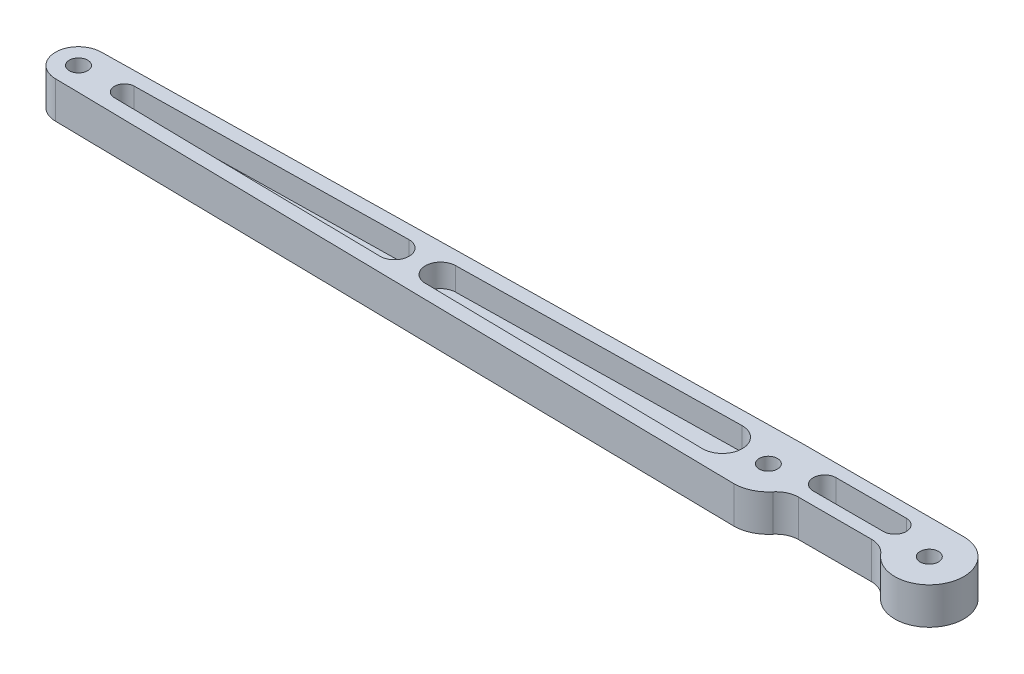
ISO-10303-21;
HEADER;
FILE_DESCRIPTION(('STEP AP214'),'2;1');
FILE_NAME('part.step','',(''),(''),'','','');
FILE_SCHEMA(('AUTOMOTIVE_DESIGN { 1 0 10303 214 1 1 1 1 }'));
ENDSEC;
DATA;
#1=APPLICATION_CONTEXT('core data for automotive mechanical design processes');
#2=APPLICATION_PROTOCOL_DEFINITION('international standard','automotive_design',2000,#1);
#3=PRODUCT_CONTEXT('',#1,'mechanical');
#4=PRODUCT('Part','Part','',(#3));
#5=PRODUCT_RELATED_PRODUCT_CATEGORY('part','',(#4));
#6=PRODUCT_DEFINITION_FORMATION('','',#4);
#7=PRODUCT_DEFINITION_CONTEXT('part definition',#1,'design');
#8=PRODUCT_DEFINITION('design','',#6,#7);
#9=PRODUCT_DEFINITION_SHAPE('','',#8);
#10=(LENGTH_UNIT() NAMED_UNIT(*) SI_UNIT(.MILLI.,.METRE.));
#11=(NAMED_UNIT(*) PLANE_ANGLE_UNIT() SI_UNIT($,.RADIAN.));
#12=(NAMED_UNIT(*) SI_UNIT($,.STERADIAN.) SOLID_ANGLE_UNIT());
#13=UNCERTAINTY_MEASURE_WITH_UNIT(LENGTH_MEASURE(1.E-05),#10,'distance_accuracy_value','');
#14=(GEOMETRIC_REPRESENTATION_CONTEXT(3) GLOBAL_UNCERTAINTY_ASSIGNED_CONTEXT((#13)) GLOBAL_UNIT_ASSIGNED_CONTEXT((#10,
#11,#12)) REPRESENTATION_CONTEXT('',''));
#15=CARTESIAN_POINT('',(0.,0.,0.));
#16=DIRECTION('',(0.,0.,1.));
#17=DIRECTION('',(1.,0.,0.));
#18=AXIS2_PLACEMENT_3D('',#15,#16,#17);
#19=CARTESIAN_POINT('',(-0.161470125479892,8.,-9.68820752879354));
#20=DIRECTION('',(0.0166643523339933,0.,0.9998611400396));
#21=DIRECTION('',(0.9998611400396,0.,-0.0166643523339933));
#22=AXIS2_PLACEMENT_3D('',#19,#20,#21);
#23=PLANE('',#22);
#24=DIRECTION('',(-0.9998611400396,0.,0.0166643523339933));
#25=VECTOR('',#24,1.);
#26=CARTESIAN_POINT('',(-0.161470125479892,0.,-9.68820752879354));
#27=LINE('',#26,#25);
#28=CARTESIAN_POINT('',(86.3429701404254,0.,-11.129948199892));
#29=VERTEX_POINT('',#28);
#30=CARTESIAN_POINT('',(-63.6570298595746,0.,-8.62994819989197));
#31=VERTEX_POINT('',#30);
#32=EDGE_CURVE('E378',#29,#31,#27,.T.);
#33=ORIENTED_EDGE('',*,*,#32,.T.);
#34=DIRECTION('',(0.,-1.,0.));
#35=VECTOR('',#34,1.);
#36=CARTESIAN_POINT('',(-63.6570298595746,8.,-8.62994819989197));
#37=LINE('',#36,#35);
#38=CARTESIAN_POINT('',(-63.6570298595746,8.,-8.62994819989197));
#39=VERTEX_POINT('',#38);
#40=EDGE_CURVE('E11',#39,#31,#37,.T.);
#41=ORIENTED_EDGE('',*,*,#40,.F.);
#42=DIRECTION('',(-0.9998611400396,0.,0.0166643523339933));
#43=VECTOR('',#42,1.);
#44=CARTESIAN_POINT('',(-0.161470125479892,8.,-9.68820752879354));
#45=LINE('',#44,#43);
#46=CARTESIAN_POINT('',(86.3429701404254,8.,-11.129948199892));
#47=VERTEX_POINT('',#46);
#48=EDGE_CURVE('E334',#47,#39,#45,.T.);
#49=ORIENTED_EDGE('',*,*,#48,.F.);
#50=DIRECTION('',(0.,-1.,0.));
#51=VECTOR('',#50,1.);
#52=CARTESIAN_POINT('',(86.3429701404254,8.,-11.129948199892));
#53=LINE('',#52,#51);
#54=EDGE_CURVE('E366',#47,#29,#53,.T.);
#55=ORIENTED_EDGE('',*,*,#54,.T.);
#56=EDGE_LOOP('',(#33,#41,#49,#55));
#57=FACE_BOUND('',#56,.T.);
#58=ADVANCED_FACE('F40',(#57),#23,.F.);
#59=CARTESIAN_POINT('',(-63.6570298595746,8.,-3.62994819989196));
#60=DIRECTION('',(0.,-1.,0.));
#61=DIRECTION('',(0.,0.,-1.));
#62=AXIS2_PLACEMENT_3D('',#59,#60,#61);
#63=CYLINDRICAL_SURFACE('',#62,5.);
#64=CARTESIAN_POINT('',(-63.6570298595746,0.,-3.62994819989196));
#65=DIRECTION('',(0.,1.,0.));
#66=DIRECTION('',(0.,0.,1.));
#67=AXIS2_PLACEMENT_3D('',#64,#65,#66);
#68=CIRCLE('',#67,5.);
#69=CARTESIAN_POINT('',(-63.6570298595746,0.,1.37005180010804));
#70=VERTEX_POINT('',#69);
#71=EDGE_CURVE('E382',#31,#70,#68,.T.);
#72=ORIENTED_EDGE('',*,*,#71,.T.);
#73=DIRECTION('',(0.,-1.,0.));
#74=VECTOR('',#73,1.);
#75=CARTESIAN_POINT('',(-63.6570298595746,8.,1.37005180010804));
#76=LINE('',#75,#74);
#77=CARTESIAN_POINT('',(-63.6570298595746,8.,1.37005180010804));
#78=VERTEX_POINT('',#77);
#79=EDGE_CURVE('E49',#78,#70,#76,.T.);
#80=ORIENTED_EDGE('',*,*,#79,.F.);
#81=CARTESIAN_POINT('',(-63.6570298595746,8.,-3.62994819989196));
#82=DIRECTION('',(0.,1.,0.));
#83=DIRECTION('',(0.,0.,1.));
#84=AXIS2_PLACEMENT_3D('',#81,#82,#83);
#85=CIRCLE('',#84,5.);
#86=EDGE_CURVE('E338',#39,#78,#85,.T.);
#87=ORIENTED_EDGE('',*,*,#86,.F.);
#88=ORIENTED_EDGE('',*,*,#40,.T.);
#89=EDGE_LOOP('',(#72,#80,#87,#88));
#90=FACE_BOUND('',#89,.T.);
#91=ADVANCED_FACE('F439',(#90),#63,.T.);
#92=CARTESIAN_POINT('',(-0.0405054534479468,8.,2.43032720687681));
#93=DIRECTION('',(-0.0166643523339933,0.,0.9998611400396));
#94=DIRECTION('',(0.9998611400396,0.,0.0166643523339933));
#95=AXIS2_PLACEMENT_3D('',#92,#93,#94);
#96=PLANE('',#95);
#97=DIRECTION('',(-0.9998611400396,0.,-0.0166643523339933));
#98=VECTOR('',#97,1.);
#99=CARTESIAN_POINT('',(-0.0405054534479468,0.,2.43032720687681));
#100=LINE('',#99,#98);
#101=CARTESIAN_POINT('',(86.3429701404254,0.,3.87005180010803));
#102=VERTEX_POINT('',#101);
#103=EDGE_CURVE('E386',#102,#70,#100,.T.);
#104=ORIENTED_EDGE('',*,*,#103,.F.);
#105=DIRECTION('',(0.,-1.,0.));
#106=VECTOR('',#105,1.);
#107=CARTESIAN_POINT('',(86.3429701404254,8.,3.87005180010803));
#108=LINE('',#107,#106);
#109=CARTESIAN_POINT('',(86.3429701404254,8.,3.87005180010803));
#110=VERTEX_POINT('',#109);
#111=EDGE_CURVE('E430',#110,#102,#108,.T.);
#112=ORIENTED_EDGE('',*,*,#111,.F.);
#113=DIRECTION('',(-0.9998611400396,0.,-0.0166643523339933));
#114=VECTOR('',#113,1.);
#115=CARTESIAN_POINT('',(-0.0405054534479468,8.,2.43032720687681));
#116=LINE('',#115,#114);
#117=EDGE_CURVE('E341',#110,#78,#116,.T.);
#118=ORIENTED_EDGE('',*,*,#117,.T.);
#119=ORIENTED_EDGE('',*,*,#79,.T.);
#120=EDGE_LOOP('',(#104,#112,#118,#119));
#121=FACE_BOUND('',#120,.T.);
#122=ADVANCED_FACE('F436',(#121),#96,.T.);
#123=CARTESIAN_POINT('',(86.3429701404254,8.,-3.62994819989197));
#124=DIRECTION('',(0.,-1.,0.));
#125=DIRECTION('',(0.,0.,-1.));
#126=AXIS2_PLACEMENT_3D('',#123,#124,#125);
#127=CYLINDRICAL_SURFACE('',#126,7.5);
#128=CARTESIAN_POINT('',(86.3429701404254,0.,-3.62994819989197));
#129=DIRECTION('',(0.,1.,0.));
#130=DIRECTION('',(0.,0.,1.));
#131=AXIS2_PLACEMENT_3D('',#128,#129,#130);
#132=CIRCLE('',#131,7.5);
#133=CARTESIAN_POINT('',(92.105781954115,0.,1.17005180010803));
#134=VERTEX_POINT('',#133);
#135=EDGE_CURVE('E390',#102,#134,#132,.T.);
#136=ORIENTED_EDGE('',*,*,#135,.T.);
#137=DIRECTION('',(0.,-1.,0.));
#138=VECTOR('',#137,1.);
#139=CARTESIAN_POINT('',(92.105781954115,8.,1.17005180010803));
#140=LINE('',#139,#138);
#141=CARTESIAN_POINT('',(92.105781954115,8.,1.17005180010803));
#142=VERTEX_POINT('',#141);
#143=EDGE_CURVE('E427',#142,#134,#140,.T.);
#144=ORIENTED_EDGE('',*,*,#143,.F.);
#145=CARTESIAN_POINT('',(86.3429701404254,8.,-3.62994819989197));
#146=DIRECTION('',(0.,1.,0.));
#147=DIRECTION('',(0.,0.,1.));
#148=AXIS2_PLACEMENT_3D('',#145,#146,#147);
#149=CIRCLE('',#148,7.5);
#150=EDGE_CURVE('E345',#110,#142,#149,.T.);
#151=ORIENTED_EDGE('',*,*,#150,.F.);
#152=ORIENTED_EDGE('',*,*,#111,.T.);
#153=EDGE_LOOP('',(#136,#144,#151,#152));
#154=FACE_BOUND('',#153,.T.);
#155=ADVANCED_FACE('F449',(#154),#127,.T.);
#156=CARTESIAN_POINT('',(95.9476564965747,8.,4.37005180010804));
#157=DIRECTION('',(0.,-1.,0.));
#158=DIRECTION('',(0.,0.,-1.));
#159=AXIS2_PLACEMENT_3D('',#156,#157,#158);
#160=CYLINDRICAL_SURFACE('',#159,5.);
#161=CARTESIAN_POINT('',(95.9476564965747,0.,4.37005180010804));
#162=DIRECTION('',(0.,1.,0.));
#163=DIRECTION('',(0.,0.,1.));
#164=AXIS2_PLACEMENT_3D('',#161,#162,#163);
#165=CIRCLE('',#164,5.);
#166=CARTESIAN_POINT('',(95.9476564965747,0.,-0.629948199891965));
#167=VERTEX_POINT('',#166);
#168=EDGE_CURVE('E394',#167,#134,#165,.T.);
#169=ORIENTED_EDGE('',*,*,#168,.F.);
#170=DIRECTION('',(0.,-1.,0.));
#171=VECTOR('',#170,1.);
#172=CARTESIAN_POINT('',(95.9476564965747,8.,-0.629948199891965));
#173=LINE('',#172,#171);
#174=CARTESIAN_POINT('',(95.9476564965747,8.,-0.629948199891965));
#175=VERTEX_POINT('',#174);
#176=EDGE_CURVE('E424',#175,#167,#173,.T.);
#177=ORIENTED_EDGE('',*,*,#176,.F.);
#178=CARTESIAN_POINT('',(95.9476564965747,8.,4.37005180010804));
#179=DIRECTION('',(0.,1.,0.));
#180=DIRECTION('',(0.,0.,1.));
#181=AXIS2_PLACEMENT_3D('',#178,#179,#180);
#182=CIRCLE('',#181,5.);
#183=EDGE_CURVE('E348',#175,#142,#182,.T.);
#184=ORIENTED_EDGE('',*,*,#183,.T.);
#185=ORIENTED_EDGE('',*,*,#143,.T.);
#186=EDGE_LOOP('',(#169,#177,#184,#185));
#187=FACE_BOUND('',#186,.T.);
#188=ADVANCED_FACE('F474',(#187),#160,.F.);
#189=CARTESIAN_POINT('',(0.,8.,-0.629948199891967));
#190=DIRECTION('',(0.,0.,-1.));
#191=DIRECTION('',(-1.,0.,0.));
#192=AXIS2_PLACEMENT_3D('',#189,#190,#191);
#193=PLANE('',#192);
#194=DIRECTION('',(1.,0.,0.));
#195=VECTOR('',#194,1.);
#196=CARTESIAN_POINT('',(0.,0.,-0.629948199891967));
#197=LINE('',#196,#195);
#198=CARTESIAN_POINT('',(111.738283784276,0.,-0.629948199891965));
#199=VERTEX_POINT('',#198);
#200=EDGE_CURVE('E398',#167,#199,#197,.T.);
#201=ORIENTED_EDGE('',*,*,#200,.T.);
#202=DIRECTION('',(0.,-1.,0.));
#203=VECTOR('',#202,1.);
#204=CARTESIAN_POINT('',(111.738283784276,8.,-0.629948199891965));
#205=LINE('',#204,#203);
#206=CARTESIAN_POINT('',(111.738283784276,8.,-0.629948199891965));
#207=VERTEX_POINT('',#206);
#208=EDGE_CURVE('E421',#207,#199,#205,.T.);
#209=ORIENTED_EDGE('',*,*,#208,.F.);
#210=DIRECTION('',(1.,0.,0.));
#211=VECTOR('',#210,1.);
#212=CARTESIAN_POINT('',(0.,8.,-0.629948199891967));
#213=LINE('',#212,#211);
#214=EDGE_CURVE('E352',#175,#207,#213,.T.);
#215=ORIENTED_EDGE('',*,*,#214,.F.);
#216=ORIENTED_EDGE('',*,*,#176,.T.);
#217=EDGE_LOOP('',(#201,#209,#215,#216));
#218=FACE_BOUND('',#217,.T.);
#219=ADVANCED_FACE('F472',(#218),#193,.F.);
#220=CARTESIAN_POINT('',(111.738283784276,8.,4.37005180010804));
#221=DIRECTION('',(0.,-1.,0.));
#222=DIRECTION('',(0.,0.,-1.));
#223=AXIS2_PLACEMENT_3D('',#220,#221,#222);
#224=CYLINDRICAL_SURFACE('',#223,5.);
#225=CARTESIAN_POINT('',(111.738283784276,0.,4.37005180010804));
#226=DIRECTION('',(0.,1.,0.));
#227=DIRECTION('',(0.,0.,1.));
#228=AXIS2_PLACEMENT_3D('',#225,#226,#227);
#229=CIRCLE('',#228,5.);
#230=CARTESIAN_POINT('',(115.580158326736,0.,1.17005180010804));
#231=VERTEX_POINT('',#230);
#232=EDGE_CURVE('E402',#231,#199,#229,.T.);
#233=ORIENTED_EDGE('',*,*,#232,.F.);
#234=DIRECTION('',(0.,-1.,0.));
#235=VECTOR('',#234,1.);
#236=CARTESIAN_POINT('',(115.580158326736,8.,1.17005180010804));
#237=LINE('',#236,#235);
#238=CARTESIAN_POINT('',(115.580158326736,8.,1.17005180010804));
#239=VERTEX_POINT('',#238);
#240=EDGE_CURVE('E418',#239,#231,#237,.T.);
#241=ORIENTED_EDGE('',*,*,#240,.F.);
#242=CARTESIAN_POINT('',(111.738283784276,8.,4.37005180010804));
#243=DIRECTION('',(0.,1.,0.));
#244=DIRECTION('',(0.,0.,1.));
#245=AXIS2_PLACEMENT_3D('',#242,#243,#244);
#246=CIRCLE('',#245,5.);
#247=EDGE_CURVE('E355',#239,#207,#246,.T.);
#248=ORIENTED_EDGE('',*,*,#247,.T.);
#249=ORIENTED_EDGE('',*,*,#208,.T.);
#250=EDGE_LOOP('',(#233,#241,#248,#249));
#251=FACE_BOUND('',#250,.T.);
#252=ADVANCED_FACE('F467',(#251),#224,.F.);
#253=CARTESIAN_POINT('',(121.342970140425,8.,-3.62994819989196));
#254=DIRECTION('',(0.,-1.,0.));
#255=DIRECTION('',(0.,0.,-1.));
#256=AXIS2_PLACEMENT_3D('',#253,#254,#255);
#257=CYLINDRICAL_SURFACE('',#256,7.49999999999999);
#258=CARTESIAN_POINT('',(121.342970140425,0.,-3.62994819989196));
#259=DIRECTION('',(0.,1.,0.));
#260=DIRECTION('',(0.,0.,1.));
#261=AXIS2_PLACEMENT_3D('',#258,#259,#260);
#262=CIRCLE('',#261,7.49999999999999);
#263=CARTESIAN_POINT('',(121.342970140425,0.,-11.129948199892));
#264=VERTEX_POINT('',#263);
#265=EDGE_CURVE('E406',#231,#264,#262,.T.);
#266=ORIENTED_EDGE('',*,*,#265,.T.);
#267=DIRECTION('',(0.,-1.,0.));
#268=VECTOR('',#267,1.);
#269=CARTESIAN_POINT('',(121.342970140425,8.,-11.129948199892));
#270=LINE('',#269,#268);
#271=CARTESIAN_POINT('',(121.342970140425,8.,-11.129948199892));
#272=VERTEX_POINT('',#271);
#273=EDGE_CURVE('E415',#272,#264,#270,.T.);
#274=ORIENTED_EDGE('',*,*,#273,.F.);
#275=CARTESIAN_POINT('',(121.342970140425,8.,-3.62994819989196));
#276=DIRECTION('',(0.,1.,0.));
#277=DIRECTION('',(0.,0.,1.));
#278=AXIS2_PLACEMENT_3D('',#275,#276,#277);
#279=CIRCLE('',#278,7.49999999999999);
#280=EDGE_CURVE('E359',#239,#272,#279,.T.);
#281=ORIENTED_EDGE('',*,*,#280,.F.);
#282=ORIENTED_EDGE('',*,*,#240,.T.);
#283=EDGE_LOOP('',(#266,#274,#281,#282));
#284=FACE_BOUND('',#283,.T.);
#285=ADVANCED_FACE('F464',(#284),#257,.T.);
#286=CARTESIAN_POINT('',(-63.6570298595746,8.,-3.62994819989196));
#287=DIRECTION('',(0.,-1.,0.));
#288=DIRECTION('',(0.,0.,-1.));
#289=AXIS2_PLACEMENT_3D('',#286,#287,#288);
#290=CYLINDRICAL_SURFACE('',#289,2.);
#291=CARTESIAN_POINT('',(-63.6570298595746,8.,-3.62994819989196));
#292=DIRECTION('',(0.,1.,0.));
#293=DIRECTION('',(0.,0.,1.));
#294=AXIS2_PLACEMENT_3D('',#291,#292,#293);
#295=CIRCLE('',#294,2.);
#296=CARTESIAN_POINT('',(-63.6570298595746,8.,-1.62994819989196));
#297=VERTEX_POINT('',#296);
#298=EDGE_CURVE('E330',#297,#297,#295,.T.);
#299=ORIENTED_EDGE('',*,*,#298,.T.);
#300=EDGE_LOOP('',(#299));
#301=FACE_BOUND('',#300,.T.);
#302=CARTESIAN_POINT('',(-63.6570298595746,0.,-3.62994819989196));
#303=DIRECTION('',(0.,1.,0.));
#304=DIRECTION('',(0.,0.,1.));
#305=AXIS2_PLACEMENT_3D('',#302,#303,#304);
#306=CIRCLE('',#305,2.);
#307=CARTESIAN_POINT('',(-63.6570298595746,0.,-1.62994819989196));
#308=VERTEX_POINT('',#307);
#309=EDGE_CURVE('E374',#308,#308,#306,.T.);
#310=ORIENTED_EDGE('',*,*,#309,.F.);
#311=EDGE_LOOP('',(#310));
#312=FACE_BOUND('',#311,.T.);
#313=ADVANCED_FACE('F491',(#301,#312),#290,.F.);
#314=CARTESIAN_POINT('',(121.342970140425,8.,-3.62994819989196));
#315=DIRECTION('',(0.,-1.,0.));
#316=DIRECTION('',(0.,0.,-1.));
#317=AXIS2_PLACEMENT_3D('',#314,#315,#316);
#318=CYLINDRICAL_SURFACE('',#317,2.);
#319=CARTESIAN_POINT('',(121.342970140425,8.,-3.62994819989196));
#320=DIRECTION('',(0.,1.,0.));
#321=DIRECTION('',(0.,0.,1.));
#322=AXIS2_PLACEMENT_3D('',#319,#320,#321);
#323=CIRCLE('',#322,2.);
#324=CARTESIAN_POINT('',(121.342970140425,8.,-1.62994819989197));
#325=VERTEX_POINT('',#324);
#326=EDGE_CURVE('E325',#325,#325,#323,.T.);
#327=ORIENTED_EDGE('',*,*,#326,.T.);
#328=EDGE_LOOP('',(#327));
#329=FACE_BOUND('',#328,.T.);
#330=CARTESIAN_POINT('',(121.342970140425,0.,-3.62994819989196));
#331=DIRECTION('',(0.,1.,0.));
#332=DIRECTION('',(0.,0.,1.));
#333=AXIS2_PLACEMENT_3D('',#330,#331,#332);
#334=CIRCLE('',#333,2.);
#335=CARTESIAN_POINT('',(121.342970140425,0.,-1.62994819989197));
#336=VERTEX_POINT('',#335);
#337=EDGE_CURVE('E370',#336,#336,#334,.T.);
#338=ORIENTED_EDGE('',*,*,#337,.F.);
#339=EDGE_LOOP('',(#338));
#340=FACE_BOUND('',#339,.T.);
#341=ADVANCED_FACE('F493',(#329,#340),#318,.F.);
#342=CARTESIAN_POINT('',(86.3429701404254,8.,-3.62994819989197));
#343=DIRECTION('',(0.,-1.,0.));
#344=DIRECTION('',(0.,0.,-1.));
#345=AXIS2_PLACEMENT_3D('',#342,#343,#344);
#346=CYLINDRICAL_SURFACE('',#345,2.);
#347=CARTESIAN_POINT('',(86.3429701404254,8.,-3.62994819989197));
#348=DIRECTION('',(0.,1.,0.));
#349=DIRECTION('',(0.,0.,1.));
#350=AXIS2_PLACEMENT_3D('',#347,#348,#349);
#351=CIRCLE('',#350,2.);
#352=CARTESIAN_POINT('',(86.3429701404254,8.,-1.62994819989197));
#353=VERTEX_POINT('',#352);
#354=EDGE_CURVE('E321',#353,#353,#351,.T.);
#355=ORIENTED_EDGE('',*,*,#354,.T.);
#356=EDGE_LOOP('',(#355));
#357=FACE_BOUND('',#356,.T.);
#358=CARTESIAN_POINT('',(86.3429701404254,0.,-3.62994819989197));
#359=DIRECTION('',(0.,1.,0.));
#360=DIRECTION('',(0.,0.,1.));
#361=AXIS2_PLACEMENT_3D('',#358,#359,#360);
#362=CIRCLE('',#361,2.);
#363=CARTESIAN_POINT('',(86.3429701404254,0.,-1.62994819989197));
#364=VERTEX_POINT('',#363);
#365=EDGE_CURVE('E311',#364,#364,#362,.T.);
#366=ORIENTED_EDGE('',*,*,#365,.F.);
#367=EDGE_LOOP('',(#366));
#368=FACE_BOUND('',#367,.T.);
#369=ADVANCED_FACE('F42',(#357,#368),#346,.F.);
#370=CARTESIAN_POINT('',(0.,8.,-11.129948199892));
#371=DIRECTION('',(0.,0.,-1.));
#372=DIRECTION('',(-1.,0.,0.));
#373=AXIS2_PLACEMENT_3D('',#370,#371,#372);
#374=PLANE('',#373);
#375=DIRECTION('',(1.,0.,0.));
#376=VECTOR('',#375,1.);
#377=CARTESIAN_POINT('',(0.,0.,-11.129948199892));
#378=LINE('',#377,#376);
#379=EDGE_CURVE('E326',#29,#264,#378,.T.);
#380=ORIENTED_EDGE('',*,*,#379,.F.);
#381=ORIENTED_EDGE('',*,*,#54,.F.);
#382=DIRECTION('',(1.,0.,0.));
#383=VECTOR('',#382,1.);
#384=CARTESIAN_POINT('',(0.,8.,-11.129948199892));
#385=LINE('',#384,#383);
#386=EDGE_CURVE('E362',#47,#272,#385,.T.);
#387=ORIENTED_EDGE('',*,*,#386,.T.);
#388=ORIENTED_EDGE('',*,*,#273,.T.);
#389=EDGE_LOOP('',(#380,#381,#387,#388));
#390=FACE_BOUND('',#389,.T.);
#391=ADVANCED_FACE('F460',(#390),#374,.T.);
#392=CARTESIAN_POINT('',(0.,8.,0.));
#393=DIRECTION('',(0.,1.,0.));
#394=DIRECTION('',(0.,0.,1.));
#395=AXIS2_PLACEMENT_3D('',#392,#393,#394);
#396=PLANE('',#395);
#397=CARTESIAN_POINT('',(96.3429701404254,8.,-5.87994819989196));
#398=DIRECTION('',(0.,1.,0.));
#399=DIRECTION('',(0.,0.,1.));
#400=AXIS2_PLACEMENT_3D('',#397,#398,#399);
#401=CIRCLE('',#400,2.49999999999999);
#402=CARTESIAN_POINT('',(96.3429701404254,8.,-8.37994819989196));
#403=VERTEX_POINT('',#402);
#404=CARTESIAN_POINT('',(96.3429701404254,8.,-3.37994819989197));
#405=VERTEX_POINT('',#404);
#406=EDGE_CURVE('E56',#403,#405,#401,.T.);
#407=ORIENTED_EDGE('',*,*,#406,.F.);
#408=DIRECTION('',(-1.,0.,0.));
#409=VECTOR('',#408,1.);
#410=CARTESIAN_POINT('',(96.3429701404254,8.,-8.37994819989196));
#411=LINE('',#410,#409);
#412=CARTESIAN_POINT('',(111.599382505473,8.,-8.37994819989196));
#413=VERTEX_POINT('',#412);
#414=EDGE_CURVE('E241',#413,#403,#411,.T.);
#415=ORIENTED_EDGE('',*,*,#414,.F.);
#416=CARTESIAN_POINT('',(111.599382505473,8.,-5.87994819989196));
#417=DIRECTION('',(0.,1.,0.));
#418=DIRECTION('',(0.,0.,1.));
#419=AXIS2_PLACEMENT_3D('',#416,#417,#418);
#420=CIRCLE('',#419,2.49999999999999);
#421=CARTESIAN_POINT('',(111.599382505473,8.,-3.37994819989197));
#422=VERTEX_POINT('',#421);
#423=EDGE_CURVE('E260',#422,#413,#420,.T.);
#424=ORIENTED_EDGE('',*,*,#423,.F.);
#425=DIRECTION('',(1.,0.,0.));
#426=VECTOR('',#425,1.);
#427=CARTESIAN_POINT('',(96.3429701404254,8.,-3.37994819989197));
#428=LINE('',#427,#426);
#429=EDGE_CURVE('E256',#405,#422,#428,.T.);
#430=ORIENTED_EDGE('',*,*,#429,.F.);
#431=EDGE_LOOP('',(#407,#415,#424,#430));
#432=FACE_BOUND('',#431,.T.);
#433=CARTESIAN_POINT('',(-53.6570298595745,8.,-3.62994819989196));
#434=DIRECTION('',(0.,1.,0.));
#435=DIRECTION('',(0.,0.,1.));
#436=AXIS2_PLACEMENT_3D('',#433,#434,#435);
#437=CIRCLE('',#436,2.16636580341914);
#438=CARTESIAN_POINT('',(-53.693130942607,8.,-5.79601318184143));
#439=VERTEX_POINT('',#438);
#440=CARTESIAN_POINT('',(-53.693130942607,8.,-1.4638832179425));
#441=VERTEX_POINT('',#440);
#442=EDGE_CURVE('E64',#439,#441,#437,.T.);
#443=ORIENTED_EDGE('',*,*,#442,.F.);
#444=DIRECTION('',(-0.9998611400396,0.,0.0166643523339933));
#445=VECTOR('',#444,1.);
#446=CARTESIAN_POINT('',(-53.693130942607,8.,-5.79601318184143));
#447=LINE('',#446,#445);
#448=CARTESIAN_POINT('',(5.02471514807768,8.,-6.7746439500195));
#449=VERTEX_POINT('',#448);
#450=EDGE_CURVE('E207',#449,#439,#447,.T.);
#451=ORIENTED_EDGE('',*,*,#450,.F.);
#452=CARTESIAN_POINT('',(5.07712674391314,8.,-3.62994819989196));
#453=DIRECTION('',(0.,1.,0.));
#454=DIRECTION('',(0.,0.,1.));
#455=AXIS2_PLACEMENT_3D('',#452,#453,#454);
#456=CIRCLE('',#455,3.1451324830996);
#457=CARTESIAN_POINT('',(5.02471514807768,8.,-0.485252449764426));
#458=VERTEX_POINT('',#457);
#459=EDGE_CURVE('E211',#458,#449,#456,.T.);
#460=ORIENTED_EDGE('',*,*,#459,.F.);
#461=DIRECTION('',(0.9998611400396,0.,0.0166643523339933));
#462=VECTOR('',#461,1.);
#463=CARTESIAN_POINT('',(-53.693130942607,8.,-1.4638832179425));
#464=LINE('',#463,#462);
#465=EDGE_CURVE('E220',#441,#458,#464,.T.);
#466=ORIENTED_EDGE('',*,*,#465,.F.);
#467=EDGE_LOOP('',(#443,#451,#460,#466));
#468=FACE_BOUND('',#467,.T.);
#469=CARTESIAN_POINT('',(76.3429701404255,8.,-3.62994819989196));
#470=DIRECTION('',(0.,1.,0.));
#471=DIRECTION('',(0.,0.,1.));
#472=AXIS2_PLACEMENT_3D('',#469,#470,#471);
#473=CIRCLE('',#472,4.33273160683827);
#474=CARTESIAN_POINT('',(76.2707679743605,8.,0.702181764006951));
#475=VERTEX_POINT('',#474);
#476=CARTESIAN_POINT('',(76.2707679743605,8.,-7.96207816379088));
#477=VERTEX_POINT('',#476);
#478=EDGE_CURVE('E230',#475,#477,#473,.T.);
#479=ORIENTED_EDGE('',*,*,#478,.F.);
#480=DIRECTION('',(0.9998611400396,0.,0.0166643523339933));
#481=VECTOR('',#480,1.);
#482=CARTESIAN_POINT('',(15.0219381416906,8.,-0.318632066537544));
#483=LINE('',#482,#481);
#484=CARTESIAN_POINT('',(15.0219381416906,8.,-0.318632066537544));
#485=VERTEX_POINT('',#484);
#486=EDGE_CURVE('E282',#485,#475,#483,.T.);
#487=ORIENTED_EDGE('',*,*,#486,.F.);
#488=CARTESIAN_POINT('',(15.0771267439131,8.,-3.62994819989196));
#489=DIRECTION('',(0.,1.,0.));
#490=DIRECTION('',(0.,0.,1.));
#491=AXIS2_PLACEMENT_3D('',#488,#489,#490);
#492=CIRCLE('',#491,3.31177600643953);
#493=CARTESIAN_POINT('',(15.0219381416906,8.,-6.94126433324639));
#494=VERTEX_POINT('',#493);
#495=EDGE_CURVE('E301',#494,#485,#492,.T.);
#496=ORIENTED_EDGE('',*,*,#495,.F.);
#497=DIRECTION('',(-0.9998611400396,0.,0.0166643523339933));
#498=VECTOR('',#497,1.);
#499=CARTESIAN_POINT('',(15.0219381416906,8.,-6.94126433324639));
#500=LINE('',#499,#498);
#501=EDGE_CURVE('E297',#477,#494,#500,.T.);
#502=ORIENTED_EDGE('',*,*,#501,.F.);
#503=EDGE_LOOP('',(#479,#487,#496,#502));
#504=FACE_BOUND('',#503,.T.);
#505=ORIENTED_EDGE('',*,*,#354,.F.);
#506=EDGE_LOOP('',(#505));
#507=FACE_BOUND('',#506,.T.);
#508=ORIENTED_EDGE('',*,*,#326,.F.);
#509=EDGE_LOOP('',(#508));
#510=FACE_BOUND('',#509,.T.);
#511=ORIENTED_EDGE('',*,*,#298,.F.);
#512=EDGE_LOOP('',(#511));
#513=FACE_BOUND('',#512,.T.);
#514=ORIENTED_EDGE('',*,*,#48,.T.);
#515=ORIENTED_EDGE('',*,*,#86,.T.);
#516=ORIENTED_EDGE('',*,*,#117,.F.);
#517=ORIENTED_EDGE('',*,*,#150,.T.);
#518=ORIENTED_EDGE('',*,*,#183,.F.);
#519=ORIENTED_EDGE('',*,*,#214,.T.);
#520=ORIENTED_EDGE('',*,*,#247,.F.);
#521=ORIENTED_EDGE('',*,*,#280,.T.);
#522=ORIENTED_EDGE('',*,*,#386,.F.);
#523=EDGE_LOOP('',(#514,#515,#516,#517,#518,#519,#520,#521,#522));
#524=FACE_BOUND('',#523,.T.);
#525=ADVANCED_FACE('F453',(#432,#468,#504,#507,#510,#513,#524),#396,.T.);
#526=CARTESIAN_POINT('',(0.,0.,0.));
#527=DIRECTION('',(0.,1.,0.));
#528=DIRECTION('',(0.,0.,1.));
#529=AXIS2_PLACEMENT_3D('',#526,#527,#528);
#530=PLANE('',#529);
#531=ORIENTED_EDGE('',*,*,#365,.T.);
#532=EDGE_LOOP('',(#531));
#533=FACE_BOUND('',#532,.T.);
#534=ORIENTED_EDGE('',*,*,#337,.T.);
#535=EDGE_LOOP('',(#534));
#536=FACE_BOUND('',#535,.T.);
#537=ORIENTED_EDGE('',*,*,#309,.T.);
#538=EDGE_LOOP('',(#537));
#539=FACE_BOUND('',#538,.T.);
#540=ORIENTED_EDGE('',*,*,#32,.F.);
#541=ORIENTED_EDGE('',*,*,#379,.T.);
#542=ORIENTED_EDGE('',*,*,#265,.F.);
#543=ORIENTED_EDGE('',*,*,#232,.T.);
#544=ORIENTED_EDGE('',*,*,#200,.F.);
#545=ORIENTED_EDGE('',*,*,#168,.T.);
#546=ORIENTED_EDGE('',*,*,#135,.F.);
#547=ORIENTED_EDGE('',*,*,#103,.T.);
#548=ORIENTED_EDGE('',*,*,#71,.F.);
#549=EDGE_LOOP('',(#540,#541,#542,#543,#544,#545,#546,#547,#548));
#550=FACE_BOUND('',#549,.T.);
#551=ADVANCED_FACE('F444',(#533,#536,#539,#550),#530,.F.);
#552=CARTESIAN_POINT('',(76.3429701404255,3.,-3.62994819989196));
#553=DIRECTION('',(0.,1.,0.));
#554=DIRECTION('',(0.,0.,1.));
#555=AXIS2_PLACEMENT_3D('',#552,#553,#554);
#556=CYLINDRICAL_SURFACE('',#555,4.33273160683827);
#557=ORIENTED_EDGE('',*,*,#478,.T.);
#558=DIRECTION('',(0.,1.,0.));
#559=VECTOR('',#558,1.);
#560=CARTESIAN_POINT('',(76.2707679743605,3.,-7.96207816379088));
#561=LINE('',#560,#559);
#562=CARTESIAN_POINT('',(76.2707679743605,3.,-7.96207816379088));
#563=VERTEX_POINT('',#562);
#564=EDGE_CURVE('E294',#563,#477,#561,.T.);
#565=ORIENTED_EDGE('',*,*,#564,.F.);
#566=CARTESIAN_POINT('',(76.3429701404255,3.,-3.62994819989196));
#567=DIRECTION('',(0.,1.,0.));
#568=DIRECTION('',(0.,0.,1.));
#569=AXIS2_PLACEMENT_3D('',#566,#567,#568);
#570=CIRCLE('',#569,4.33273160683827);
#571=CARTESIAN_POINT('',(76.2707679743605,3.,0.702181764006951));
#572=VERTEX_POINT('',#571);
#573=EDGE_CURVE('E277',#572,#563,#570,.T.);
#574=ORIENTED_EDGE('',*,*,#573,.F.);
#575=DIRECTION('',(0.,1.,0.));
#576=VECTOR('',#575,1.);
#577=CARTESIAN_POINT('',(76.2707679743605,3.,0.702181764006951));
#578=LINE('',#577,#576);
#579=EDGE_CURVE('E308',#572,#475,#578,.T.);
#580=ORIENTED_EDGE('',*,*,#579,.T.);
#581=EDGE_LOOP('',(#557,#565,#574,#580));
#582=FACE_BOUND('',#581,.T.);
#583=ADVANCED_FACE('F507',(#582),#556,.F.);
#584=CARTESIAN_POINT('',(15.0219381416906,3.,-0.318632066537544));
#585=DIRECTION('',(-0.0166643523339933,0.,0.9998611400396));
#586=DIRECTION('',(0.9998611400396,0.,0.0166643523339933));
#587=AXIS2_PLACEMENT_3D('',#584,#585,#586);
#588=PLANE('',#587);
#589=ORIENTED_EDGE('',*,*,#486,.T.);
#590=ORIENTED_EDGE('',*,*,#579,.F.);
#591=DIRECTION('',(0.9998611400396,0.,0.0166643523339933));
#592=VECTOR('',#591,1.);
#593=CARTESIAN_POINT('',(15.0219381416906,3.,-0.318632066537544));
#594=LINE('',#593,#592);
#595=CARTESIAN_POINT('',(15.0219381416906,3.,-0.318632066537544));
#596=VERTEX_POINT('',#595);
#597=EDGE_CURVE('E290',#596,#572,#594,.T.);
#598=ORIENTED_EDGE('',*,*,#597,.F.);
#599=DIRECTION('',(0.,1.,0.));
#600=VECTOR('',#599,1.);
#601=CARTESIAN_POINT('',(15.0219381416906,3.,-0.318632066537544));
#602=LINE('',#601,#600);
#603=EDGE_CURVE('E312',#596,#485,#602,.T.);
#604=ORIENTED_EDGE('',*,*,#603,.T.);
#605=EDGE_LOOP('',(#589,#590,#598,#604));
#606=FACE_BOUND('',#605,.T.);
#607=ADVANCED_FACE('F516',(#606),#588,.F.);
#608=CARTESIAN_POINT('',(15.0771267439131,3.,-3.62994819989196));
#609=DIRECTION('',(0.,1.,0.));
#610=DIRECTION('',(0.,0.,1.));
#611=AXIS2_PLACEMENT_3D('',#608,#609,#610);
#612=CYLINDRICAL_SURFACE('',#611,3.31177600643953);
#613=ORIENTED_EDGE('',*,*,#495,.T.);
#614=ORIENTED_EDGE('',*,*,#603,.F.);
#615=CARTESIAN_POINT('',(15.0771267439131,3.,-3.62994819989196));
#616=DIRECTION('',(0.,1.,0.));
#617=DIRECTION('',(0.,0.,1.));
#618=AXIS2_PLACEMENT_3D('',#615,#616,#617);
#619=CIRCLE('',#618,3.31177600643953);
#620=CARTESIAN_POINT('',(15.0219381416906,3.,-6.94126433324639));
#621=VERTEX_POINT('',#620);
#622=EDGE_CURVE('E286',#621,#596,#619,.T.);
#623=ORIENTED_EDGE('',*,*,#622,.F.);
#624=DIRECTION('',(0.,1.,0.));
#625=VECTOR('',#624,1.);
#626=CARTESIAN_POINT('',(15.0219381416906,3.,-6.94126433324639));
#627=LINE('',#626,#625);
#628=EDGE_CURVE('E315',#621,#494,#627,.T.);
#629=ORIENTED_EDGE('',*,*,#628,.T.);
#630=EDGE_LOOP('',(#613,#614,#623,#629));
#631=FACE_BOUND('',#630,.T.);
#632=ADVANCED_FACE('F580',(#631),#612,.F.);
#633=CARTESIAN_POINT('',(15.0219381416906,3.,-6.94126433324639));
#634=DIRECTION('',(-0.0166643523339933,0.,-0.9998611400396));
#635=DIRECTION('',(-0.9998611400396,0.,0.0166643523339933));
#636=AXIS2_PLACEMENT_3D('',#633,#634,#635);
#637=PLANE('',#636);
#638=ORIENTED_EDGE('',*,*,#501,.T.);
#639=ORIENTED_EDGE('',*,*,#628,.F.);
#640=DIRECTION('',(-0.9998611400396,0.,0.0166643523339933));
#641=VECTOR('',#640,1.);
#642=CARTESIAN_POINT('',(15.0219381416906,3.,-6.94126433324639));
#643=LINE('',#642,#641);
#644=EDGE_CURVE('E281',#563,#621,#643,.T.);
#645=ORIENTED_EDGE('',*,*,#644,.F.);
#646=ORIENTED_EDGE('',*,*,#564,.T.);
#647=EDGE_LOOP('',(#638,#639,#645,#646));
#648=FACE_BOUND('',#647,.T.);
#649=ADVANCED_FACE('F590',(#648),#637,.F.);
#650=CARTESIAN_POINT('',(76.3429701404255,3.,-3.62994819989196));
#651=DIRECTION('',(0.,1.,0.));
#652=DIRECTION('',(0.,0.,1.));
#653=AXIS2_PLACEMENT_3D('',#650,#651,#652);
#654=PLANE('',#653);
#655=ORIENTED_EDGE('',*,*,#573,.T.);
#656=ORIENTED_EDGE('',*,*,#644,.T.);
#657=ORIENTED_EDGE('',*,*,#622,.T.);
#658=ORIENTED_EDGE('',*,*,#597,.T.);
#659=EDGE_LOOP('',(#655,#656,#657,#658));
#660=FACE_BOUND('',#659,.T.);
#661=ADVANCED_FACE('F600',(#660),#654,.T.);
#662=CARTESIAN_POINT('',(-53.6570298595745,3.,-3.62994819989196));
#663=DIRECTION('',(0.,1.,0.));
#664=DIRECTION('',(0.,0.,1.));
#665=AXIS2_PLACEMENT_3D('',#662,#663,#664);
#666=CYLINDRICAL_SURFACE('',#665,2.16636580341914);
#667=ORIENTED_EDGE('',*,*,#442,.T.);
#668=DIRECTION('',(0.,1.,0.));
#669=VECTOR('',#668,1.);
#670=CARTESIAN_POINT('',(-53.693130942607,3.,-1.4638832179425));
#671=LINE('',#670,#669);
#672=CARTESIAN_POINT('',(-53.693130942607,3.,-1.4638832179425));
#673=VERTEX_POINT('',#672);
#674=EDGE_CURVE('E182',#673,#441,#671,.T.);
#675=ORIENTED_EDGE('',*,*,#674,.F.);
#676=CARTESIAN_POINT('',(-53.6570298595745,3.,-3.62994819989196));
#677=DIRECTION('',(0.,1.,0.));
#678=DIRECTION('',(0.,0.,1.));
#679=AXIS2_PLACEMENT_3D('',#676,#677,#678);
#680=CIRCLE('',#679,2.16636580341914);
#681=CARTESIAN_POINT('',(-53.693130942607,3.,-5.79601318184143));
#682=VERTEX_POINT('',#681);
#683=EDGE_CURVE('E186',#682,#673,#680,.T.);
#684=ORIENTED_EDGE('',*,*,#683,.F.);
#685=DIRECTION('',(0.,1.,0.));
#686=VECTOR('',#685,1.);
#687=CARTESIAN_POINT('',(-53.693130942607,3.,-5.79601318184143));
#688=LINE('',#687,#686);
#689=EDGE_CURVE('E227',#682,#439,#688,.T.);
#690=ORIENTED_EDGE('',*,*,#689,.T.);
#691=EDGE_LOOP('',(#667,#675,#684,#690));
#692=FACE_BOUND('',#691,.T.);
#693=ADVANCED_FACE('F184',(#692),#666,.F.);
#694=CARTESIAN_POINT('',(-53.693130942607,3.,-5.79601318184143));
#695=DIRECTION('',(-0.0166643523339933,0.,-0.9998611400396));
#696=DIRECTION('',(-0.9998611400396,0.,0.0166643523339933));
#697=AXIS2_PLACEMENT_3D('',#694,#695,#696);
#698=PLANE('',#697);
#699=ORIENTED_EDGE('',*,*,#450,.T.);
#700=ORIENTED_EDGE('',*,*,#689,.F.);
#701=DIRECTION('',(-0.9998611400396,0.,0.0166643523339933));
#702=VECTOR('',#701,1.);
#703=CARTESIAN_POINT('',(-53.693130942607,3.,-5.79601318184143));
#704=LINE('',#703,#702);
#705=CARTESIAN_POINT('',(5.02471514807768,3.,-6.7746439500195));
#706=VERTEX_POINT('',#705);
#707=EDGE_CURVE('E193',#706,#682,#704,.T.);
#708=ORIENTED_EDGE('',*,*,#707,.F.);
#709=DIRECTION('',(0.,1.,0.));
#710=VECTOR('',#709,1.);
#711=CARTESIAN_POINT('',(5.02471514807768,3.,-6.7746439500195));
#712=LINE('',#711,#710);
#713=EDGE_CURVE('E231',#706,#449,#712,.T.);
#714=ORIENTED_EDGE('',*,*,#713,.T.);
#715=EDGE_LOOP('',(#699,#700,#708,#714));
#716=FACE_BOUND('',#715,.T.);
#717=ADVANCED_FACE('F619',(#716),#698,.F.);
#718=CARTESIAN_POINT('',(5.07712674391314,3.,-3.62994819989196));
#719=DIRECTION('',(0.,1.,0.));
#720=DIRECTION('',(0.,0.,1.));
#721=AXIS2_PLACEMENT_3D('',#718,#719,#720);
#722=CYLINDRICAL_SURFACE('',#721,3.1451324830996);
#723=ORIENTED_EDGE('',*,*,#459,.T.);
#724=ORIENTED_EDGE('',*,*,#713,.F.);
#725=CARTESIAN_POINT('',(5.07712674391314,3.,-3.62994819989196));
#726=DIRECTION('',(0.,1.,0.));
#727=DIRECTION('',(0.,0.,1.));
#728=AXIS2_PLACEMENT_3D('',#725,#726,#727);
#729=CIRCLE('',#728,3.1451324830996);
#730=CARTESIAN_POINT('',(5.02471514807768,3.,-0.485252449764426));
#731=VERTEX_POINT('',#730);
#732=EDGE_CURVE('E202',#731,#706,#729,.T.);
#733=ORIENTED_EDGE('',*,*,#732,.F.);
#734=DIRECTION('',(0.,1.,0.));
#735=VECTOR('',#734,1.);
#736=CARTESIAN_POINT('',(5.02471514807768,3.,-0.485252449764426));
#737=LINE('',#736,#735);
#738=EDGE_CURVE('E192',#731,#458,#737,.T.);
#739=ORIENTED_EDGE('',*,*,#738,.T.);
#740=EDGE_LOOP('',(#723,#724,#733,#739));
#741=FACE_BOUND('',#740,.T.);
#742=ADVANCED_FACE('F628',(#741),#722,.F.);
#743=CARTESIAN_POINT('',(-53.693130942607,3.,-1.4638832179425));
#744=DIRECTION('',(-0.0166643523339933,0.,0.9998611400396));
#745=DIRECTION('',(0.9998611400396,0.,0.0166643523339933));
#746=AXIS2_PLACEMENT_3D('',#743,#744,#745);
#747=PLANE('',#746);
#748=ORIENTED_EDGE('',*,*,#465,.T.);
#749=ORIENTED_EDGE('',*,*,#738,.F.);
#750=DIRECTION('',(0.9998611400396,0.,0.0166643523339933));
#751=VECTOR('',#750,1.);
#752=CARTESIAN_POINT('',(-53.693130942607,3.,-1.4638832179425));
#753=LINE('',#752,#751);
#754=EDGE_CURVE('E196',#673,#731,#753,.T.);
#755=ORIENTED_EDGE('',*,*,#754,.F.);
#756=ORIENTED_EDGE('',*,*,#674,.T.);
#757=EDGE_LOOP('',(#748,#749,#755,#756));
#758=FACE_BOUND('',#757,.T.);
#759=ADVANCED_FACE('F197',(#758),#747,.F.);
#760=CARTESIAN_POINT('',(-53.6570298595745,3.,-3.62994819989196));
#761=DIRECTION('',(0.,1.,0.));
#762=DIRECTION('',(0.,0.,1.));
#763=AXIS2_PLACEMENT_3D('',#760,#761,#762);
#764=PLANE('',#763);
#765=ORIENTED_EDGE('',*,*,#683,.T.);
#766=ORIENTED_EDGE('',*,*,#754,.T.);
#767=ORIENTED_EDGE('',*,*,#732,.T.);
#768=ORIENTED_EDGE('',*,*,#707,.T.);
#769=EDGE_LOOP('',(#765,#766,#767,#768));
#770=FACE_BOUND('',#769,.T.);
#771=ADVANCED_FACE('F204',(#770),#764,.T.);
#772=CARTESIAN_POINT('',(96.3429701404254,3.,-5.87994819989196));
#773=DIRECTION('',(0.,1.,0.));
#774=DIRECTION('',(0.,0.,1.));
#775=AXIS2_PLACEMENT_3D('',#772,#773,#774);
#776=CYLINDRICAL_SURFACE('',#775,2.49999999999999);
#777=ORIENTED_EDGE('',*,*,#406,.T.);
#778=DIRECTION('',(0.,1.,0.));
#779=VECTOR('',#778,1.);
#780=CARTESIAN_POINT('',(96.3429701404254,3.,-3.37994819989197));
#781=LINE('',#780,#779);
#782=CARTESIAN_POINT('',(96.3429701404254,3.,-3.37994819989197));
#783=VERTEX_POINT('',#782);
#784=EDGE_CURVE('E253',#783,#405,#781,.T.);
#785=ORIENTED_EDGE('',*,*,#784,.F.);
#786=CARTESIAN_POINT('',(96.3429701404254,3.,-5.87994819989196));
#787=DIRECTION('',(0.,1.,0.));
#788=DIRECTION('',(0.,0.,1.));
#789=AXIS2_PLACEMENT_3D('',#786,#787,#788);
#790=CIRCLE('',#789,2.49999999999999);
#791=CARTESIAN_POINT('',(96.3429701404254,3.,-8.37994819989196));
#792=VERTEX_POINT('',#791);
#793=EDGE_CURVE('E236',#792,#783,#790,.T.);
#794=ORIENTED_EDGE('',*,*,#793,.F.);
#795=DIRECTION('',(0.,1.,0.));
#796=VECTOR('',#795,1.);
#797=CARTESIAN_POINT('',(96.3429701404254,3.,-8.37994819989196));
#798=LINE('',#797,#796);
#799=EDGE_CURVE('E221',#792,#403,#798,.T.);
#800=ORIENTED_EDGE('',*,*,#799,.T.);
#801=EDGE_LOOP('',(#777,#785,#794,#800));
#802=FACE_BOUND('',#801,.T.);
#803=ADVANCED_FACE('F655',(#802),#776,.F.);
#804=CARTESIAN_POINT('',(96.3429701404254,3.,-8.37994819989196));
#805=DIRECTION('',(0.,0.,-1.));
#806=DIRECTION('',(-1.,0.,0.));
#807=AXIS2_PLACEMENT_3D('',#804,#805,#806);
#808=PLANE('',#807);
#809=ORIENTED_EDGE('',*,*,#414,.T.);
#810=ORIENTED_EDGE('',*,*,#799,.F.);
#811=DIRECTION('',(-1.,0.,0.));
#812=VECTOR('',#811,1.);
#813=CARTESIAN_POINT('',(96.3429701404254,3.,-8.37994819989196));
#814=LINE('',#813,#812);
#815=CARTESIAN_POINT('',(111.599382505473,3.,-8.37994819989196));
#816=VERTEX_POINT('',#815);
#817=EDGE_CURVE('E249',#816,#792,#814,.T.);
#818=ORIENTED_EDGE('',*,*,#817,.F.);
#819=DIRECTION('',(0.,1.,0.));
#820=VECTOR('',#819,1.);
#821=CARTESIAN_POINT('',(111.599382505473,3.,-8.37994819989196));
#822=LINE('',#821,#820);
#823=EDGE_CURVE('E269',#816,#413,#822,.T.);
#824=ORIENTED_EDGE('',*,*,#823,.T.);
#825=EDGE_LOOP('',(#809,#810,#818,#824));
#826=FACE_BOUND('',#825,.T.);
#827=ADVANCED_FACE('F664',(#826),#808,.F.);
#828=CARTESIAN_POINT('',(111.599382505473,3.,-5.87994819989196));
#829=DIRECTION('',(0.,1.,0.));
#830=DIRECTION('',(0.,0.,1.));
#831=AXIS2_PLACEMENT_3D('',#828,#829,#830);
#832=CYLINDRICAL_SURFACE('',#831,2.49999999999999);
#833=ORIENTED_EDGE('',*,*,#423,.T.);
#834=ORIENTED_EDGE('',*,*,#823,.F.);
#835=CARTESIAN_POINT('',(111.599382505473,3.,-5.87994819989196));
#836=DIRECTION('',(0.,1.,0.));
#837=DIRECTION('',(0.,0.,1.));
#838=AXIS2_PLACEMENT_3D('',#835,#836,#837);
#839=CIRCLE('',#838,2.49999999999999);
#840=CARTESIAN_POINT('',(111.599382505473,3.,-3.37994819989197));
#841=VERTEX_POINT('',#840);
#842=EDGE_CURVE('E245',#841,#816,#839,.T.);
#843=ORIENTED_EDGE('',*,*,#842,.F.);
#844=DIRECTION('',(0.,1.,0.));
#845=VECTOR('',#844,1.);
#846=CARTESIAN_POINT('',(111.599382505473,3.,-3.37994819989197));
#847=LINE('',#846,#845);
#848=EDGE_CURVE('E272',#841,#422,#847,.T.);
#849=ORIENTED_EDGE('',*,*,#848,.T.);
#850=EDGE_LOOP('',(#833,#834,#843,#849));
#851=FACE_BOUND('',#850,.T.);
#852=ADVANCED_FACE('F673',(#851),#832,.F.);
#853=CARTESIAN_POINT('',(96.3429701404254,3.,-3.37994819989197));
#854=DIRECTION('',(0.,0.,1.));
#855=DIRECTION('',(1.,0.,0.));
#856=AXIS2_PLACEMENT_3D('',#853,#854,#855);
#857=PLANE('',#856);
#858=ORIENTED_EDGE('',*,*,#429,.T.);
#859=ORIENTED_EDGE('',*,*,#848,.F.);
#860=DIRECTION('',(1.,0.,0.));
#861=VECTOR('',#860,1.);
#862=CARTESIAN_POINT('',(96.3429701404254,3.,-3.37994819989197));
#863=LINE('',#862,#861);
#864=EDGE_CURVE('E240',#783,#841,#863,.T.);
#865=ORIENTED_EDGE('',*,*,#864,.F.);
#866=ORIENTED_EDGE('',*,*,#784,.T.);
#867=EDGE_LOOP('',(#858,#859,#865,#866));
#868=FACE_BOUND('',#867,.T.);
#869=ADVANCED_FACE('F683',(#868),#857,.F.);
#870=CARTESIAN_POINT('',(96.3429701404254,3.,-5.87994819989196));
#871=DIRECTION('',(0.,1.,0.));
#872=DIRECTION('',(0.,0.,1.));
#873=AXIS2_PLACEMENT_3D('',#870,#871,#872);
#874=PLANE('',#873);
#875=ORIENTED_EDGE('',*,*,#793,.T.);
#876=ORIENTED_EDGE('',*,*,#864,.T.);
#877=ORIENTED_EDGE('',*,*,#842,.T.);
#878=ORIENTED_EDGE('',*,*,#817,.T.);
#879=EDGE_LOOP('',(#875,#876,#877,#878));
#880=FACE_BOUND('',#879,.T.);
#881=ADVANCED_FACE('F693',(#880),#874,.T.);
#882=CLOSED_SHELL('',(#58,#91,#122,#155,#188,#219,#252,#285,#313,#341,#369,#391,#525,#551,#583,
#607,#632,#649,#661,#693,#717,#742,#759,#771,#803,#827,#852,#869,#881));
#883=MANIFOLD_SOLID_BREP('B2',#882);
#884=ADVANCED_BREP_SHAPE_REPRESENTATION('',(#18,#883),#14);
#885=SHAPE_DEFINITION_REPRESENTATION(#9,#884);
ENDSEC;
END-ISO-10303-21;
